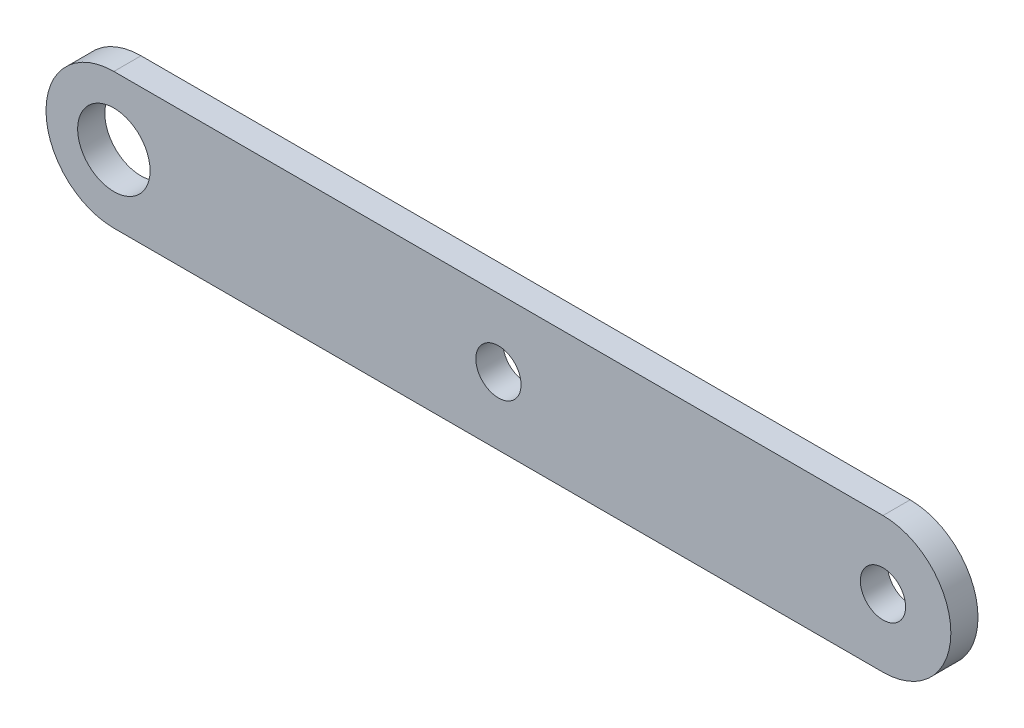
ISO-10303-21;
HEADER;
FILE_DESCRIPTION(('STEP AP214'),'2;1');
FILE_NAME('part.step','',(''),(''),'','','');
FILE_SCHEMA(('AUTOMOTIVE_DESIGN { 1 0 10303 214 1 1 1 1 }'));
ENDSEC;
DATA;
#1=APPLICATION_CONTEXT('core data for automotive mechanical design processes');
#2=APPLICATION_PROTOCOL_DEFINITION('international standard','automotive_design',2000,#1);
#3=PRODUCT_CONTEXT('',#1,'mechanical');
#4=PRODUCT('Part','Part','',(#3));
#5=PRODUCT_RELATED_PRODUCT_CATEGORY('part','',(#4));
#6=PRODUCT_DEFINITION_FORMATION('','',#4);
#7=PRODUCT_DEFINITION_CONTEXT('part definition',#1,'design');
#8=PRODUCT_DEFINITION('design','',#6,#7);
#9=PRODUCT_DEFINITION_SHAPE('','',#8);
#10=(LENGTH_UNIT() NAMED_UNIT(*) SI_UNIT(.MILLI.,.METRE.));
#11=(NAMED_UNIT(*) PLANE_ANGLE_UNIT() SI_UNIT($,.RADIAN.));
#12=(NAMED_UNIT(*) SI_UNIT($,.STERADIAN.) SOLID_ANGLE_UNIT());
#13=UNCERTAINTY_MEASURE_WITH_UNIT(LENGTH_MEASURE(1.E-05),#10,'distance_accuracy_value','');
#14=(GEOMETRIC_REPRESENTATION_CONTEXT(3) GLOBAL_UNCERTAINTY_ASSIGNED_CONTEXT((#13)) GLOBAL_UNIT_ASSIGNED_CONTEXT((#10,
#11,#12)) REPRESENTATION_CONTEXT('',''));
#15=CARTESIAN_POINT('',(0.,0.,0.));
#16=DIRECTION('',(0.,0.,1.));
#17=DIRECTION('',(1.,0.,0.));
#18=AXIS2_PLACEMENT_3D('',#15,#16,#17);
#19=CARTESIAN_POINT('',(42.5,0.,3.));
#20=DIRECTION('',(0.,0.,1.));
#21=DIRECTION('',(1.,0.,0.));
#22=AXIS2_PLACEMENT_3D('',#19,#20,#21);
#23=PLANE('',#22);
#24=CARTESIAN_POINT('',(42.5,0.,3.));
#25=DIRECTION('',(0.,0.,1.));
#26=DIRECTION('',(1.,0.,0.));
#27=AXIS2_PLACEMENT_3D('',#24,#25,#26);
#28=CIRCLE('',#27,2.5);
#29=CARTESIAN_POINT('',(45.,0.,3.));
#30=VERTEX_POINT('',#29);
#31=EDGE_CURVE('E117',#30,#30,#28,.T.);
#32=ORIENTED_EDGE('',*,*,#31,.F.);
#33=EDGE_LOOP('',(#32));
#34=FACE_BOUND('',#33,.T.);
#35=CARTESIAN_POINT('',(42.5,0.,3.));
#36=DIRECTION('',(0.,0.,1.));
#37=DIRECTION('',(1.,0.,0.));
#38=AXIS2_PLACEMENT_3D('',#35,#36,#37);
#39=CIRCLE('',#38,7.5);
#40=CARTESIAN_POINT('',(42.5,-7.5,3.));
#41=VERTEX_POINT('',#40);
#42=CARTESIAN_POINT('',(42.5,7.5,3.));
#43=VERTEX_POINT('',#42);
#44=EDGE_CURVE('E87',#41,#43,#39,.T.);
#45=ORIENTED_EDGE('',*,*,#44,.T.);
#46=DIRECTION('',(-1.,0.,0.));
#47=VECTOR('',#46,1.);
#48=CARTESIAN_POINT('',(-42.5,7.5,3.));
#49=LINE('',#48,#47);
#50=CARTESIAN_POINT('',(-42.5,7.5,3.));
#51=VERTEX_POINT('',#50);
#52=EDGE_CURVE('E82',#43,#51,#49,.T.);
#53=ORIENTED_EDGE('',*,*,#52,.T.);
#54=CARTESIAN_POINT('',(-42.5,0.,3.));
#55=DIRECTION('',(0.,0.,1.));
#56=DIRECTION('',(1.,0.,0.));
#57=AXIS2_PLACEMENT_3D('',#54,#55,#56);
#58=CIRCLE('',#57,7.5);
#59=CARTESIAN_POINT('',(-42.5,-7.5,3.));
#60=VERTEX_POINT('',#59);
#61=EDGE_CURVE('E85',#51,#60,#58,.T.);
#62=ORIENTED_EDGE('',*,*,#61,.T.);
#63=DIRECTION('',(1.,0.,0.));
#64=VECTOR('',#63,1.);
#65=CARTESIAN_POINT('',(-42.5,-7.5,3.));
#66=LINE('',#65,#64);
#67=EDGE_CURVE('E52',#60,#41,#66,.T.);
#68=ORIENTED_EDGE('',*,*,#67,.T.);
#69=EDGE_LOOP('',(#45,#53,#62,#68));
#70=FACE_BOUND('',#69,.T.);
#71=CARTESIAN_POINT('',(-42.5,0.,3.));
#72=DIRECTION('',(0.,0.,1.));
#73=DIRECTION('',(1.,0.,0.));
#74=AXIS2_PLACEMENT_3D('',#71,#72,#73);
#75=CIRCLE('',#74,4.);
#76=CARTESIAN_POINT('',(-38.5,0.,3.));
#77=VERTEX_POINT('',#76);
#78=EDGE_CURVE('E102',#77,#77,#75,.T.);
#79=ORIENTED_EDGE('',*,*,#78,.F.);
#80=EDGE_LOOP('',(#79));
#81=FACE_BOUND('',#80,.T.);
#82=CARTESIAN_POINT('',(0.,0.,3.));
#83=DIRECTION('',(0.,0.,1.));
#84=DIRECTION('',(1.,0.,0.));
#85=AXIS2_PLACEMENT_3D('',#82,#83,#84);
#86=CIRCLE('',#85,2.5);
#87=CARTESIAN_POINT('',(2.49999999999999,0.,3.));
#88=VERTEX_POINT('',#87);
#89=EDGE_CURVE('E123',#88,#88,#86,.T.);
#90=ORIENTED_EDGE('',*,*,#89,.F.);
#91=EDGE_LOOP('',(#90));
#92=FACE_BOUND('',#91,.T.);
#93=ADVANCED_FACE('F35',(#34,#70,#81,#92),#23,.T.);
#94=CARTESIAN_POINT('',(42.5,0.,0.));
#95=DIRECTION('',(0.,0.,1.));
#96=DIRECTION('',(1.,0.,0.));
#97=AXIS2_PLACEMENT_3D('',#94,#95,#96);
#98=PLANE('',#97);
#99=CARTESIAN_POINT('',(42.5,0.,0.));
#100=DIRECTION('',(0.,0.,1.));
#101=DIRECTION('',(1.,0.,0.));
#102=AXIS2_PLACEMENT_3D('',#99,#100,#101);
#103=CIRCLE('',#102,2.5);
#104=CARTESIAN_POINT('',(45.,0.,0.));
#105=VERTEX_POINT('',#104);
#106=EDGE_CURVE('E120',#105,#105,#103,.T.);
#107=ORIENTED_EDGE('',*,*,#106,.T.);
#108=EDGE_LOOP('',(#107));
#109=FACE_BOUND('',#108,.T.);
#110=CARTESIAN_POINT('',(42.5,0.,0.));
#111=DIRECTION('',(0.,0.,1.));
#112=DIRECTION('',(1.,0.,0.));
#113=AXIS2_PLACEMENT_3D('',#110,#111,#112);
#114=CIRCLE('',#113,7.5);
#115=CARTESIAN_POINT('',(42.5,-7.5,0.));
#116=VERTEX_POINT('',#115);
#117=CARTESIAN_POINT('',(42.5,7.5,0.));
#118=VERTEX_POINT('',#117);
#119=EDGE_CURVE('E99',#116,#118,#114,.T.);
#120=ORIENTED_EDGE('',*,*,#119,.F.);
#121=DIRECTION('',(1.,0.,0.));
#122=VECTOR('',#121,1.);
#123=CARTESIAN_POINT('',(-42.5,-7.5,0.));
#124=LINE('',#123,#122);
#125=CARTESIAN_POINT('',(-42.5,-7.5,0.));
#126=VERTEX_POINT('',#125);
#127=EDGE_CURVE('E75',#126,#116,#124,.T.);
#128=ORIENTED_EDGE('',*,*,#127,.F.);
#129=CARTESIAN_POINT('',(-42.5,0.,0.));
#130=DIRECTION('',(0.,0.,1.));
#131=DIRECTION('',(1.,0.,0.));
#132=AXIS2_PLACEMENT_3D('',#129,#130,#131);
#133=CIRCLE('',#132,7.5);
#134=CARTESIAN_POINT('',(-42.5,7.5,0.));
#135=VERTEX_POINT('',#134);
#136=EDGE_CURVE('E69',#135,#126,#133,.T.);
#137=ORIENTED_EDGE('',*,*,#136,.F.);
#138=DIRECTION('',(-1.,0.,0.));
#139=VECTOR('',#138,1.);
#140=CARTESIAN_POINT('',(-42.5,7.5,0.));
#141=LINE('',#140,#139);
#142=EDGE_CURVE('E91',#118,#135,#141,.T.);
#143=ORIENTED_EDGE('',*,*,#142,.F.);
#144=EDGE_LOOP('',(#120,#128,#137,#143));
#145=FACE_BOUND('',#144,.T.);
#146=CARTESIAN_POINT('',(-42.5,0.,0.));
#147=DIRECTION('',(0.,0.,1.));
#148=DIRECTION('',(1.,0.,0.));
#149=AXIS2_PLACEMENT_3D('',#146,#147,#148);
#150=CIRCLE('',#149,4.);
#151=CARTESIAN_POINT('',(-38.5,0.,0.));
#152=VERTEX_POINT('',#151);
#153=EDGE_CURVE('E114',#152,#152,#150,.T.);
#154=ORIENTED_EDGE('',*,*,#153,.T.);
#155=EDGE_LOOP('',(#154));
#156=FACE_BOUND('',#155,.T.);
#157=CARTESIAN_POINT('',(0.,0.,0.));
#158=DIRECTION('',(0.,0.,1.));
#159=DIRECTION('',(1.,0.,0.));
#160=AXIS2_PLACEMENT_3D('',#157,#158,#159);
#161=CIRCLE('',#160,2.5);
#162=CARTESIAN_POINT('',(2.49999999999999,0.,0.));
#163=VERTEX_POINT('',#162);
#164=EDGE_CURVE('E126',#163,#163,#161,.T.);
#165=ORIENTED_EDGE('',*,*,#164,.T.);
#166=EDGE_LOOP('',(#165));
#167=FACE_BOUND('',#166,.T.);
#168=ADVANCED_FACE('F110',(#109,#145,#156,#167),#98,.F.);
#169=CARTESIAN_POINT('',(42.5,0.,3.));
#170=DIRECTION('',(0.,0.,-1.));
#171=DIRECTION('',(-1.,0.,0.));
#172=AXIS2_PLACEMENT_3D('',#169,#170,#171);
#173=CYLINDRICAL_SURFACE('',#172,7.5);
#174=ORIENTED_EDGE('',*,*,#119,.T.);
#175=DIRECTION('',(0.,0.,-1.));
#176=VECTOR('',#175,1.);
#177=CARTESIAN_POINT('',(42.5,7.5,3.));
#178=LINE('',#177,#176);
#179=EDGE_CURVE('E11',#43,#118,#178,.T.);
#180=ORIENTED_EDGE('',*,*,#179,.F.);
#181=ORIENTED_EDGE('',*,*,#44,.F.);
#182=DIRECTION('',(0.,0.,-1.));
#183=VECTOR('',#182,1.);
#184=CARTESIAN_POINT('',(42.5,-7.5,3.));
#185=LINE('',#184,#183);
#186=EDGE_CURVE('E95',#41,#116,#185,.T.);
#187=ORIENTED_EDGE('',*,*,#186,.T.);
#188=EDGE_LOOP('',(#174,#180,#181,#187));
#189=FACE_BOUND('',#188,.T.);
#190=ADVANCED_FACE('F37',(#189),#173,.T.);
#191=CARTESIAN_POINT('',(-42.5,7.5,3.));
#192=DIRECTION('',(0.,-1.,0.));
#193=DIRECTION('',(0.,0.,-1.));
#194=AXIS2_PLACEMENT_3D('',#191,#192,#193);
#195=PLANE('',#194);
#196=ORIENTED_EDGE('',*,*,#142,.T.);
#197=DIRECTION('',(0.,0.,-1.));
#198=VECTOR('',#197,1.);
#199=CARTESIAN_POINT('',(-42.5,7.5,3.));
#200=LINE('',#199,#198);
#201=EDGE_CURVE('E44',#51,#135,#200,.T.);
#202=ORIENTED_EDGE('',*,*,#201,.F.);
#203=ORIENTED_EDGE('',*,*,#52,.F.);
#204=ORIENTED_EDGE('',*,*,#179,.T.);
#205=EDGE_LOOP('',(#196,#202,#203,#204));
#206=FACE_BOUND('',#205,.T.);
#207=ADVANCED_FACE('F90',(#206),#195,.F.);
#208=CARTESIAN_POINT('',(-42.5,0.,3.));
#209=DIRECTION('',(0.,0.,-1.));
#210=DIRECTION('',(-1.,0.,0.));
#211=AXIS2_PLACEMENT_3D('',#208,#209,#210);
#212=CYLINDRICAL_SURFACE('',#211,7.5);
#213=ORIENTED_EDGE('',*,*,#136,.T.);
#214=DIRECTION('',(0.,0.,-1.));
#215=VECTOR('',#214,1.);
#216=CARTESIAN_POINT('',(-42.5,-7.5,3.));
#217=LINE('',#216,#215);
#218=EDGE_CURVE('E92',#60,#126,#217,.T.);
#219=ORIENTED_EDGE('',*,*,#218,.F.);
#220=ORIENTED_EDGE('',*,*,#61,.F.);
#221=ORIENTED_EDGE('',*,*,#201,.T.);
#222=EDGE_LOOP('',(#213,#219,#220,#221));
#223=FACE_BOUND('',#222,.T.);
#224=ADVANCED_FACE('F93',(#223),#212,.T.);
#225=CARTESIAN_POINT('',(-42.5,-7.5,3.));
#226=DIRECTION('',(0.,1.,0.));
#227=DIRECTION('',(0.,0.,1.));
#228=AXIS2_PLACEMENT_3D('',#225,#226,#227);
#229=PLANE('',#228);
#230=ORIENTED_EDGE('',*,*,#127,.T.);
#231=ORIENTED_EDGE('',*,*,#186,.F.);
#232=ORIENTED_EDGE('',*,*,#67,.F.);
#233=ORIENTED_EDGE('',*,*,#218,.T.);
#234=EDGE_LOOP('',(#230,#231,#232,#233));
#235=FACE_BOUND('',#234,.T.);
#236=ADVANCED_FACE('F107',(#235),#229,.F.);
#237=CARTESIAN_POINT('',(-42.5,0.,3.));
#238=DIRECTION('',(0.,0.,-1.));
#239=DIRECTION('',(-1.,0.,0.));
#240=AXIS2_PLACEMENT_3D('',#237,#238,#239);
#241=CYLINDRICAL_SURFACE('',#240,4.);
#242=ORIENTED_EDGE('',*,*,#78,.T.);
#243=EDGE_LOOP('',(#242));
#244=FACE_BOUND('',#243,.T.);
#245=ORIENTED_EDGE('',*,*,#153,.F.);
#246=EDGE_LOOP('',(#245));
#247=FACE_BOUND('',#246,.T.);
#248=ADVANCED_FACE('F145',(#244,#247),#241,.F.);
#249=CARTESIAN_POINT('',(42.5,0.,3.));
#250=DIRECTION('',(0.,0.,-1.));
#251=DIRECTION('',(-1.,0.,0.));
#252=AXIS2_PLACEMENT_3D('',#249,#250,#251);
#253=CYLINDRICAL_SURFACE('',#252,2.5);
#254=ORIENTED_EDGE('',*,*,#31,.T.);
#255=EDGE_LOOP('',(#254));
#256=FACE_BOUND('',#255,.T.);
#257=ORIENTED_EDGE('',*,*,#106,.F.);
#258=EDGE_LOOP('',(#257));
#259=FACE_BOUND('',#258,.T.);
#260=ADVANCED_FACE('F191',(#256,#259),#253,.F.);
#261=CARTESIAN_POINT('',(0.,0.,3.));
#262=DIRECTION('',(0.,0.,-1.));
#263=DIRECTION('',(-1.,0.,0.));
#264=AXIS2_PLACEMENT_3D('',#261,#262,#263);
#265=CYLINDRICAL_SURFACE('',#264,2.5);
#266=ORIENTED_EDGE('',*,*,#89,.T.);
#267=EDGE_LOOP('',(#266));
#268=FACE_BOUND('',#267,.T.);
#269=ORIENTED_EDGE('',*,*,#164,.F.);
#270=EDGE_LOOP('',(#269));
#271=FACE_BOUND('',#270,.T.);
#272=ADVANCED_FACE('F132',(#268,#271),#265,.F.);
#273=CLOSED_SHELL('',(#93,#168,#190,#207,#224,#236,#248,#260,#272));
#274=MANIFOLD_SOLID_BREP('B2',#273);
#275=ADVANCED_BREP_SHAPE_REPRESENTATION('',(#18,#274),#14);
#276=SHAPE_DEFINITION_REPRESENTATION(#9,#275);
ENDSEC;
END-ISO-10303-21;
